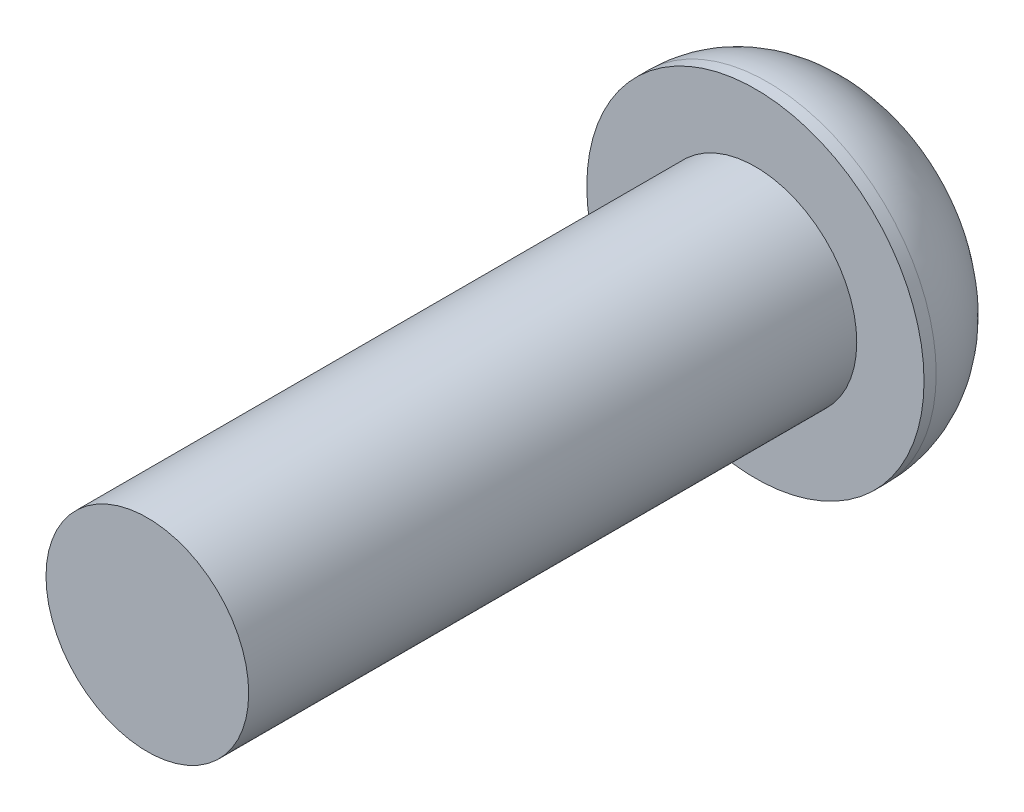
ISO-10303-21;
HEADER;
FILE_DESCRIPTION(('STEP AP214'),'2;1');
FILE_NAME('part.step','',(''),(''),'','','');
FILE_SCHEMA(('AUTOMOTIVE_DESIGN { 1 0 10303 214 1 1 1 1 }'));
ENDSEC;
DATA;
#1=APPLICATION_CONTEXT('core data for automotive mechanical design processes');
#2=APPLICATION_PROTOCOL_DEFINITION('international standard','automotive_design',2000,#1);
#3=PRODUCT_CONTEXT('',#1,'mechanical');
#4=PRODUCT('Part','Part','',(#3));
#5=PRODUCT_RELATED_PRODUCT_CATEGORY('part','',(#4));
#6=PRODUCT_DEFINITION_FORMATION('','',#4);
#7=PRODUCT_DEFINITION_CONTEXT('part definition',#1,'design');
#8=PRODUCT_DEFINITION('design','',#6,#7);
#9=PRODUCT_DEFINITION_SHAPE('','',#8);
#10=(LENGTH_UNIT() NAMED_UNIT(*) SI_UNIT(.MILLI.,.METRE.));
#11=(NAMED_UNIT(*) PLANE_ANGLE_UNIT() SI_UNIT($,.RADIAN.));
#12=(NAMED_UNIT(*) SI_UNIT($,.STERADIAN.) SOLID_ANGLE_UNIT());
#13=UNCERTAINTY_MEASURE_WITH_UNIT(LENGTH_MEASURE(1.E-05),#10,'distance_accuracy_value','');
#14=(GEOMETRIC_REPRESENTATION_CONTEXT(3) GLOBAL_UNCERTAINTY_ASSIGNED_CONTEXT((#13)) GLOBAL_UNIT_ASSIGNED_CONTEXT((#10,
#11,#12)) REPRESENTATION_CONTEXT('',''));
#15=CARTESIAN_POINT('',(0.,0.,0.));
#16=DIRECTION('',(0.,0.,1.));
#17=DIRECTION('',(1.,0.,0.));
#18=AXIS2_PLACEMENT_3D('',#15,#16,#17);
#19=CARTESIAN_POINT('',(0.,0.,15.));
#20=DIRECTION('',(0.,0.,-1.));
#21=DIRECTION('',(-1.,0.,0.));
#22=AXIS2_PLACEMENT_3D('',#19,#20,#21);
#23=CYLINDRICAL_SURFACE('',#22,2.5);
#24=CARTESIAN_POINT('',(0.,0.,15.));
#25=DIRECTION('',(0.,0.,1.));
#26=DIRECTION('',(1.,0.,0.));
#27=AXIS2_PLACEMENT_3D('',#24,#25,#26);
#28=CIRCLE('',#27,2.5);
#29=CARTESIAN_POINT('',(2.5,0.,15.));
#30=VERTEX_POINT('',#29);
#31=EDGE_CURVE('E146',#30,#30,#28,.T.);
#32=ORIENTED_EDGE('',*,*,#31,.F.);
#33=EDGE_LOOP('',(#32));
#34=FACE_BOUND('',#33,.T.);
#35=CARTESIAN_POINT('',(0.,0.,0.));
#36=DIRECTION('',(0.,0.,-1.));
#37=DIRECTION('',(-1.,0.,0.));
#38=AXIS2_PLACEMENT_3D('',#35,#36,#37);
#39=CIRCLE('',#38,2.5);
#40=CARTESIAN_POINT('',(-2.5,0.,0.));
#41=VERTEX_POINT('',#40);
#42=EDGE_CURVE('E143',#41,#41,#39,.T.);
#43=ORIENTED_EDGE('',*,*,#42,.F.);
#44=EDGE_LOOP('',(#43));
#45=FACE_BOUND('',#44,.T.);
#46=ADVANCED_FACE('F33',(#34,#45),#23,.T.);
#47=CARTESIAN_POINT('',(0.,0.,15.));
#48=DIRECTION('',(0.,0.,1.));
#49=DIRECTION('',(1.,0.,0.));
#50=AXIS2_PLACEMENT_3D('',#47,#48,#49);
#51=PLANE('',#50);
#52=ORIENTED_EDGE('',*,*,#31,.T.);
#53=EDGE_LOOP('',(#52));
#54=FACE_BOUND('',#53,.T.);
#55=ADVANCED_FACE('F167',(#54),#51,.T.);
#56=CARTESIAN_POINT('',(0.,0.,0.));
#57=DIRECTION('',(0.,0.,-1.));
#58=DIRECTION('',(-1.,0.,0.));
#59=AXIS2_PLACEMENT_3D('',#56,#57,#58);
#60=PLANE('',#59);
#61=CARTESIAN_POINT('',(0.,0.,0.));
#62=DIRECTION('',(0.,0.,-1.));
#63=DIRECTION('',(-1.,0.,0.));
#64=AXIS2_PLACEMENT_3D('',#61,#62,#63);
#65=CIRCLE('',#64,4.15958487677486);
#66=CARTESIAN_POINT('',(-4.15958487677486,0.,0.));
#67=VERTEX_POINT('',#66);
#68=EDGE_CURVE('E135',#67,#67,#65,.T.);
#69=ORIENTED_EDGE('',*,*,#68,.F.);
#70=EDGE_LOOP('',(#69));
#71=FACE_BOUND('',#70,.T.);
#72=ORIENTED_EDGE('',*,*,#42,.T.);
#73=EDGE_LOOP('',(#72));
#74=FACE_BOUND('',#73,.T.);
#75=ADVANCED_FACE('F172',(#71,#74),#60,.F.);
#76=CARTESIAN_POINT('',(0.,0.,-2.8));
#77=DIRECTION('',(0.,0.,1.));
#78=DIRECTION('',(1.,0.,0.));
#79=AXIS2_PLACEMENT_3D('',#76,#77,#78);
#80=CYLINDRICAL_SURFACE('',#79,4.15958487677486);
#81=CARTESIAN_POINT('',(0.,0.,-0.3));
#82=DIRECTION('',(0.,0.,-1.));
#83=DIRECTION('',(-1.,0.,0.));
#84=AXIS2_PLACEMENT_3D('',#81,#82,#83);
#85=CIRCLE('',#84,4.15958487677486);
#86=CARTESIAN_POINT('',(-4.15958487677486,0.,-0.3));
#87=VERTEX_POINT('',#86);
#88=EDGE_CURVE('E11',#87,#87,#85,.F.);
#89=ORIENTED_EDGE('',*,*,#88,.T.);
#90=EDGE_LOOP('',(#89));
#91=FACE_BOUND('',#90,.T.);
#92=ORIENTED_EDGE('',*,*,#68,.T.);
#93=EDGE_LOOP('',(#92));
#94=FACE_BOUND('',#93,.T.);
#95=ADVANCED_FACE('F162',(#91,#94),#80,.T.);
#96=CARTESIAN_POINT('',(0.,0.,-2.8));
#97=DIRECTION('',(0.,0.,-1.));
#98=DIRECTION('',(-1.,0.,0.));
#99=AXIS2_PLACEMENT_3D('',#96,#97,#98);
#100=PLANE('',#99);
#101=DIRECTION('',(-0.814788791019046,0.579757902947188,0.));
#102=VECTOR('',#101,1.);
#103=CARTESIAN_POINT('',(-0.144973678126217,-1.52414450415627,-2.8));
#104=LINE('',#103,#102);
#105=CARTESIAN_POINT('',(-0.144973678126217,-1.52414450415627,-2.8));
#106=VERTEX_POINT('',#105);
#107=CARTESIAN_POINT('',(-1.39243469870088,-0.636521363940765,-2.8));
#108=VERTEX_POINT('',#107);
#109=EDGE_CURVE('E48',#106,#108,#104,.T.);
#110=ORIENTED_EDGE('',*,*,#109,.F.);
#111=DIRECTION('',(-0.909479467506581,-0.415748840267711,0.));
#112=VECTOR('',#111,1.);
#113=CARTESIAN_POINT('',(1.24746102057466,-0.887623140215509,-2.8));
#114=LINE('',#113,#112);
#115=CARTESIAN_POINT('',(1.24746102057466,-0.887623140215509,-2.8));
#116=VERTEX_POINT('',#115);
#117=EDGE_CURVE('E131',#116,#106,#114,.T.);
#118=ORIENTED_EDGE('',*,*,#117,.F.);
#119=DIRECTION('',(-0.0946906764875342,-0.995506743214898,0.));
#120=VECTOR('',#119,1.);
#121=CARTESIAN_POINT('',(1.39243469870088,0.636521363940765,-2.8));
#122=LINE('',#121,#120);
#123=CARTESIAN_POINT('',(1.39243469870088,0.636521363940765,-2.8));
#124=VERTEX_POINT('',#123);
#125=EDGE_CURVE('E129',#124,#116,#122,.T.);
#126=ORIENTED_EDGE('',*,*,#125,.F.);
#127=DIRECTION('',(0.814788791019046,-0.579757902947188,0.));
#128=VECTOR('',#127,1.);
#129=CARTESIAN_POINT('',(0.144973678126217,1.52414450415627,-2.8));
#130=LINE('',#129,#128);
#131=CARTESIAN_POINT('',(0.144973678126217,1.52414450415627,-2.8));
#132=VERTEX_POINT('',#131);
#133=EDGE_CURVE('E96',#132,#124,#130,.T.);
#134=ORIENTED_EDGE('',*,*,#133,.F.);
#135=DIRECTION('',(0.909479467506581,0.41574884026771,0.));
#136=VECTOR('',#135,1.);
#137=CARTESIAN_POINT('',(-1.24746102057466,0.88762314021551,-2.8));
#138=LINE('',#137,#136);
#139=CARTESIAN_POINT('',(-1.24746102057466,0.88762314021551,-2.8));
#140=VERTEX_POINT('',#139);
#141=EDGE_CURVE('E125',#140,#132,#138,.T.);
#142=ORIENTED_EDGE('',*,*,#141,.F.);
#143=DIRECTION('',(0.0946906764875343,0.995506743214898,0.));
#144=VECTOR('',#143,1.);
#145=CARTESIAN_POINT('',(-1.39243469870088,-0.636521363940765,-2.8));
#146=LINE('',#145,#144);
#147=EDGE_CURVE('E122',#108,#140,#146,.T.);
#148=ORIENTED_EDGE('',*,*,#147,.F.);
#149=EDGE_LOOP('',(#110,#118,#126,#134,#142,#148));
#150=FACE_BOUND('',#149,.T.);
#151=CARTESIAN_POINT('',(0.,0.,-2.8));
#152=DIRECTION('',(0.,0.,-1.));
#153=DIRECTION('',(-1.,0.,0.));
#154=AXIS2_PLACEMENT_3D('',#151,#152,#153);
#155=CIRCLE('',#154,1.65958487677486);
#156=CARTESIAN_POINT('',(-1.65958487677486,0.,-2.8));
#157=VERTEX_POINT('',#156);
#158=EDGE_CURVE('E41',#157,#157,#155,.T.);
#159=ORIENTED_EDGE('',*,*,#158,.T.);
#160=EDGE_LOOP('',(#159));
#161=FACE_BOUND('',#160,.T.);
#162=ADVANCED_FACE('F151',(#150,#161),#100,.T.);
#163=CARTESIAN_POINT('',(0.,0.,-0.3));
#164=DIRECTION('',(0.,0.,-1.));
#165=DIRECTION('',(-1.,0.,0.));
#166=AXIS2_PLACEMENT_3D('',#163,#164,#165);
#167=DEGENERATE_TOROIDAL_SURFACE('',#166,1.65958487677486,2.5,.T.);
#168=ORIENTED_EDGE('',*,*,#88,.F.);
#169=EDGE_LOOP('',(#168));
#170=FACE_BOUND('',#169,.T.);
#171=ORIENTED_EDGE('',*,*,#158,.F.);
#172=EDGE_LOOP('',(#171));
#173=FACE_BOUND('',#172,.T.);
#174=ADVANCED_FACE('F35',(#170,#173),#167,.T.);
#175=CARTESIAN_POINT('',(-0.144973678126217,-1.52414450415627,-0.8));
#176=DIRECTION('',(-0.579757902947188,-0.814788791019046,0.));
#177=DIRECTION('',(0.814788791019046,-0.579757902947188,0.));
#178=AXIS2_PLACEMENT_3D('',#175,#176,#177);
#179=PLANE('',#178);
#180=ORIENTED_EDGE('',*,*,#109,.T.);
#181=DIRECTION('',(0.,0.,-1.));
#182=VECTOR('',#181,1.);
#183=CARTESIAN_POINT('',(-1.39243469870088,-0.636521363940765,-0.8));
#184=LINE('',#183,#182);
#185=CARTESIAN_POINT('',(-1.39243469870088,-0.636521363940765,-0.8));
#186=VERTEX_POINT('',#185);
#187=EDGE_CURVE('E78',#186,#108,#184,.T.);
#188=ORIENTED_EDGE('',*,*,#187,.F.);
#189=DIRECTION('',(-0.814788791019046,0.579757902947188,0.));
#190=VECTOR('',#189,1.);
#191=CARTESIAN_POINT('',(-0.144973678126217,-1.52414450415627,-0.8));
#192=LINE('',#191,#190);
#193=CARTESIAN_POINT('',(-0.144973678126217,-1.52414450415627,-0.8));
#194=VERTEX_POINT('',#193);
#195=EDGE_CURVE('E133',#194,#186,#192,.T.);
#196=ORIENTED_EDGE('',*,*,#195,.F.);
#197=DIRECTION('',(0.,0.,-1.));
#198=VECTOR('',#197,1.);
#199=CARTESIAN_POINT('',(-0.144973678126217,-1.52414450415627,-0.8));
#200=LINE('',#199,#198);
#201=EDGE_CURVE('E56',#194,#106,#200,.T.);
#202=ORIENTED_EDGE('',*,*,#201,.T.);
#203=EDGE_LOOP('',(#180,#188,#196,#202));
#204=FACE_BOUND('',#203,.T.);
#205=ADVANCED_FACE('F154',(#204),#179,.F.);
#206=CARTESIAN_POINT('',(1.24746102057466,-0.887623140215509,-0.8));
#207=DIRECTION('',(0.415748840267711,-0.909479467506581,0.));
#208=DIRECTION('',(0.909479467506581,0.415748840267711,0.));
#209=AXIS2_PLACEMENT_3D('',#206,#207,#208);
#210=PLANE('',#209);
#211=ORIENTED_EDGE('',*,*,#117,.T.);
#212=ORIENTED_EDGE('',*,*,#201,.F.);
#213=DIRECTION('',(-0.909479467506581,-0.415748840267711,0.));
#214=VECTOR('',#213,1.);
#215=CARTESIAN_POINT('',(1.24746102057466,-0.887623140215509,-0.8));
#216=LINE('',#215,#214);
#217=CARTESIAN_POINT('',(1.24746102057466,-0.887623140215509,-0.8));
#218=VERTEX_POINT('',#217);
#219=EDGE_CURVE('E108',#218,#194,#216,.T.);
#220=ORIENTED_EDGE('',*,*,#219,.F.);
#221=DIRECTION('',(0.,0.,-1.));
#222=VECTOR('',#221,1.);
#223=CARTESIAN_POINT('',(1.24746102057466,-0.887623140215509,-0.8));
#224=LINE('',#223,#222);
#225=EDGE_CURVE('E100',#218,#116,#224,.T.);
#226=ORIENTED_EDGE('',*,*,#225,.T.);
#227=EDGE_LOOP('',(#211,#212,#220,#226));
#228=FACE_BOUND('',#227,.T.);
#229=ADVANCED_FACE('F160',(#228),#210,.F.);
#230=CARTESIAN_POINT('',(1.39243469870088,0.636521363940765,-0.8));
#231=DIRECTION('',(0.995506743214898,-0.0946906764875343,0.));
#232=DIRECTION('',(0.0946906764875343,0.995506743214898,0.));
#233=AXIS2_PLACEMENT_3D('',#230,#231,#232);
#234=PLANE('',#233);
#235=ORIENTED_EDGE('',*,*,#125,.T.);
#236=ORIENTED_EDGE('',*,*,#225,.F.);
#237=DIRECTION('',(-0.0946906764875342,-0.995506743214898,0.));
#238=VECTOR('',#237,1.);
#239=CARTESIAN_POINT('',(1.39243469870088,0.636521363940765,-0.8));
#240=LINE('',#239,#238);
#241=CARTESIAN_POINT('',(1.39243469870088,0.636521363940765,-0.8));
#242=VERTEX_POINT('',#241);
#243=EDGE_CURVE('E104',#242,#218,#240,.T.);
#244=ORIENTED_EDGE('',*,*,#243,.F.);
#245=DIRECTION('',(0.,0.,-1.));
#246=VECTOR('',#245,1.);
#247=CARTESIAN_POINT('',(1.39243469870088,0.636521363940765,-0.8));
#248=LINE('',#247,#246);
#249=EDGE_CURVE('E89',#242,#124,#248,.T.);
#250=ORIENTED_EDGE('',*,*,#249,.T.);
#251=EDGE_LOOP('',(#235,#236,#244,#250));
#252=FACE_BOUND('',#251,.T.);
#253=ADVANCED_FACE('F105',(#252),#234,.F.);
#254=CARTESIAN_POINT('',(0.144973678126217,1.52414450415627,-0.8));
#255=DIRECTION('',(0.579757902947188,0.814788791019046,0.));
#256=DIRECTION('',(-0.814788791019047,0.579757902947188,0.));
#257=AXIS2_PLACEMENT_3D('',#254,#255,#256);
#258=PLANE('',#257);
#259=ORIENTED_EDGE('',*,*,#133,.T.);
#260=ORIENTED_EDGE('',*,*,#249,.F.);
#261=DIRECTION('',(0.814788791019046,-0.579757902947188,0.));
#262=VECTOR('',#261,1.);
#263=CARTESIAN_POINT('',(0.144973678126217,1.52414450415627,-0.8));
#264=LINE('',#263,#262);
#265=CARTESIAN_POINT('',(0.144973678126217,1.52414450415627,-0.8));
#266=VERTEX_POINT('',#265);
#267=EDGE_CURVE('E93',#266,#242,#264,.T.);
#268=ORIENTED_EDGE('',*,*,#267,.F.);
#269=DIRECTION('',(0.,0.,-1.));
#270=VECTOR('',#269,1.);
#271=CARTESIAN_POINT('',(0.144973678126217,1.52414450415627,-0.8));
#272=LINE('',#271,#270);
#273=EDGE_CURVE('E101',#266,#132,#272,.T.);
#274=ORIENTED_EDGE('',*,*,#273,.T.);
#275=EDGE_LOOP('',(#259,#260,#268,#274));
#276=FACE_BOUND('',#275,.T.);
#277=ADVANCED_FACE('F91',(#276),#258,.F.);
#278=CARTESIAN_POINT('',(-1.24746102057466,0.88762314021551,-0.8));
#279=DIRECTION('',(-0.41574884026771,0.909479467506581,0.));
#280=DIRECTION('',(-0.909479467506581,-0.41574884026771,0.));
#281=AXIS2_PLACEMENT_3D('',#278,#279,#280);
#282=PLANE('',#281);
#283=ORIENTED_EDGE('',*,*,#141,.T.);
#284=ORIENTED_EDGE('',*,*,#273,.F.);
#285=DIRECTION('',(0.909479467506581,0.41574884026771,0.));
#286=VECTOR('',#285,1.);
#287=CARTESIAN_POINT('',(-1.24746102057466,0.88762314021551,-0.8));
#288=LINE('',#287,#286);
#289=CARTESIAN_POINT('',(-1.24746102057466,0.88762314021551,-0.8));
#290=VERTEX_POINT('',#289);
#291=EDGE_CURVE('E114',#290,#266,#288,.T.);
#292=ORIENTED_EDGE('',*,*,#291,.F.);
#293=DIRECTION('',(0.,0.,-1.));
#294=VECTOR('',#293,1.);
#295=CARTESIAN_POINT('',(-1.24746102057466,0.88762314021551,-0.8));
#296=LINE('',#295,#294);
#297=EDGE_CURVE('E138',#290,#140,#296,.T.);
#298=ORIENTED_EDGE('',*,*,#297,.T.);
#299=EDGE_LOOP('',(#283,#284,#292,#298));
#300=FACE_BOUND('',#299,.T.);
#301=ADVANCED_FACE('F187',(#300),#282,.F.);
#302=CARTESIAN_POINT('',(-1.39243469870088,-0.636521363940765,-0.8));
#303=DIRECTION('',(-0.995506743214898,0.0946906764875343,0.));
#304=DIRECTION('',(-0.0946906764875343,-0.995506743214898,0.));
#305=AXIS2_PLACEMENT_3D('',#302,#303,#304);
#306=PLANE('',#305);
#307=ORIENTED_EDGE('',*,*,#147,.T.);
#308=ORIENTED_EDGE('',*,*,#297,.F.);
#309=DIRECTION('',(0.0946906764875343,0.995506743214898,0.));
#310=VECTOR('',#309,1.);
#311=CARTESIAN_POINT('',(-1.39243469870088,-0.636521363940765,-0.8));
#312=LINE('',#311,#310);
#313=EDGE_CURVE('E116',#186,#290,#312,.T.);
#314=ORIENTED_EDGE('',*,*,#313,.F.);
#315=ORIENTED_EDGE('',*,*,#187,.T.);
#316=EDGE_LOOP('',(#307,#308,#314,#315));
#317=FACE_BOUND('',#316,.T.);
#318=ADVANCED_FACE('F184',(#317),#306,.F.);
#319=CARTESIAN_POINT('',(0.,0.,-0.8));
#320=DIRECTION('',(0.,0.,-1.));
#321=DIRECTION('',(-1.,0.,0.));
#322=AXIS2_PLACEMENT_3D('',#319,#320,#321);
#323=PLANE('',#322);
#324=ORIENTED_EDGE('',*,*,#195,.T.);
#325=ORIENTED_EDGE('',*,*,#313,.T.);
#326=ORIENTED_EDGE('',*,*,#291,.T.);
#327=ORIENTED_EDGE('',*,*,#267,.T.);
#328=ORIENTED_EDGE('',*,*,#243,.T.);
#329=ORIENTED_EDGE('',*,*,#219,.T.);
#330=EDGE_LOOP('',(#324,#325,#326,#327,#328,#329));
#331=FACE_BOUND('',#330,.T.);
#332=ADVANCED_FACE('F111',(#331),#323,.T.);
#333=CLOSED_SHELL('',(#46,#55,#75,#95,#162,#174,#205,#229,#253,#277,#301,#318,#332));
#334=MANIFOLD_SOLID_BREP('B2',#333);
#335=ADVANCED_BREP_SHAPE_REPRESENTATION('',(#18,#334),#14);
#336=SHAPE_DEFINITION_REPRESENTATION(#9,#335);
ENDSEC;
END-ISO-10303-21;
